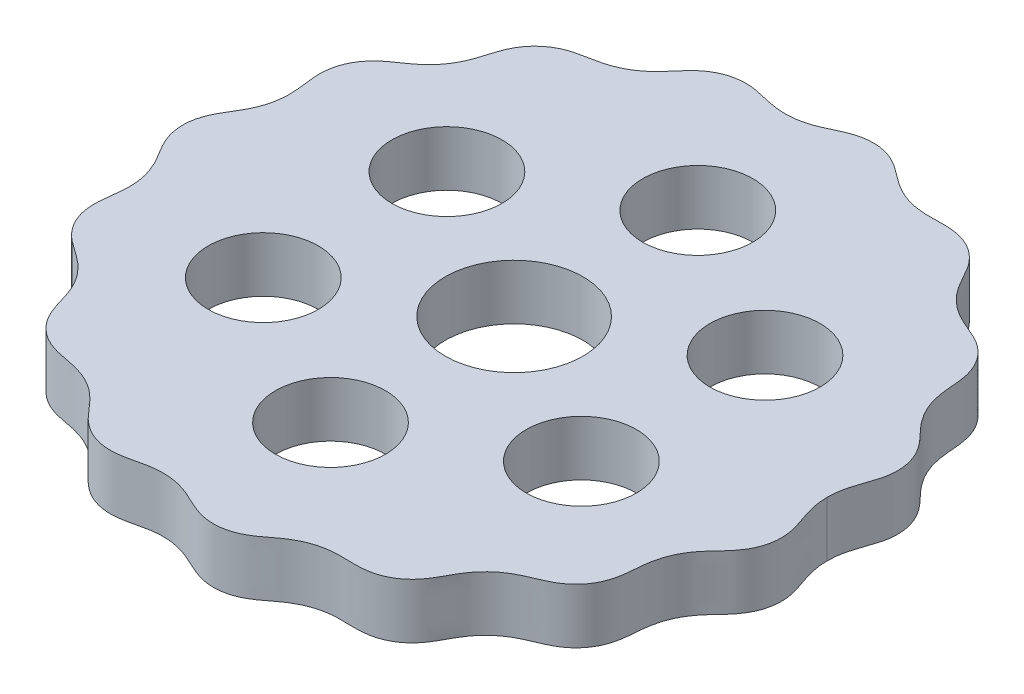
ISO-10303-21;
HEADER;
FILE_DESCRIPTION(('STEP AP214'),'2;1');
FILE_NAME('part.step','',(''),(''),'','','');
FILE_SCHEMA(('AUTOMOTIVE_DESIGN { 1 0 10303 214 1 1 1 1 }'));
ENDSEC;
DATA;
#1=APPLICATION_CONTEXT('core data for automotive mechanical design processes');
#2=APPLICATION_PROTOCOL_DEFINITION('international standard','automotive_design',2000,#1);
#3=PRODUCT_CONTEXT('',#1,'mechanical');
#4=PRODUCT('Part','Part','',(#3));
#5=PRODUCT_RELATED_PRODUCT_CATEGORY('part','',(#4));
#6=PRODUCT_DEFINITION_FORMATION('','',#4);
#7=PRODUCT_DEFINITION_CONTEXT('part definition',#1,'design');
#8=PRODUCT_DEFINITION('design','',#6,#7);
#9=PRODUCT_DEFINITION_SHAPE('','',#8);
#10=(LENGTH_UNIT() NAMED_UNIT(*) SI_UNIT(.MILLI.,.METRE.));
#11=(NAMED_UNIT(*) PLANE_ANGLE_UNIT() SI_UNIT($,.RADIAN.));
#12=(NAMED_UNIT(*) SI_UNIT($,.STERADIAN.) SOLID_ANGLE_UNIT());
#13=UNCERTAINTY_MEASURE_WITH_UNIT(LENGTH_MEASURE(1.E-05),#10,'distance_accuracy_value','');
#14=(GEOMETRIC_REPRESENTATION_CONTEXT(3) GLOBAL_UNCERTAINTY_ASSIGNED_CONTEXT((#13)) GLOBAL_UNIT_ASSIGNED_CONTEXT((#10,
#11,#12)) REPRESENTATION_CONTEXT('',''));
#15=CARTESIAN_POINT('',(0.,0.,0.));
#16=DIRECTION('',(0.,0.,1.));
#17=DIRECTION('',(1.,0.,0.));
#18=AXIS2_PLACEMENT_3D('',#15,#16,#17);
#19=CARTESIAN_POINT('',(-35.1,6.,-1.35889516192071E-12));
#20=CARTESIAN_POINT('',(-35.1000000000083,6.,0.607115846350076));
#21=CARTESIAN_POINT('',(-34.9035600959464,6.,1.83414533775393));
#22=CARTESIAN_POINT('',(-34.0534432954252,6.,3.45944018642695));
#23=CARTESIAN_POINT('',(-33.0776124702075,6.,4.95884864860067));
#24=CARTESIAN_POINT('',(-32.4003701245092,6.,6.61149440452536));
#25=CARTESIAN_POINT('',(-32.1262299289566,6.,8.37766255840162));
#26=CARTESIAN_POINT('',(-32.2542709762599,6.,10.1551809611175));
#27=CARTESIAN_POINT('',(-32.5481890198447,6.,11.9412915781165));
#28=CARTESIAN_POINT('',(-32.3951682574332,6.,13.7860860109237));
#29=CARTESIAN_POINT('',(-31.6585541398098,6.,15.4884654092379));
#30=CARTESIAN_POINT('',(-30.4193559166323,6.,16.8654573614074));
#31=CARTESIAN_POINT('',(-28.8990414539917,6.,17.8542998251563));
#32=CARTESIAN_POINT('',(-27.4779756494178,6.,18.9294391734281));
#33=CARTESIAN_POINT('',(-26.3272029489261,6.,20.2969563921251));
#34=CARTESIAN_POINT('',(-25.5276464963381,6.,21.8947419545972));
#35=CARTESIAN_POINT('',(-25.0543546395131,6.,23.6168737991937));
#36=CARTESIAN_POINT('',(-24.2447417173247,6.,25.9251570963651));
#37=CARTESIAN_POINT('',(-22.3688342971235,6.,27.6956794406858));
#38=CARTESIAN_POINT('',(-20.0034613218681,6.,28.3479396382792));
#39=CARTESIAN_POINT('',(-18.2333283288682,6.,28.6161520403931));
#40=CARTESIAN_POINT('',(-16.5433330334016,6.,29.1931204752014));
#41=CARTESIAN_POINT('',(-15.0321793566839,6.,30.1474106772307));
#42=CARTESIAN_POINT('',(-13.7791000612083,6.,31.4151591584304));
#43=CARTESIAN_POINT('',(-12.6573823156915,6.,32.8313003415023));
#44=CARTESIAN_POINT('',(-11.2102625001448,6.,33.9831920915477));
#45=CARTESIAN_POINT('',(-9.46489468071028,6.,34.6119091760879));
#46=CARTESIAN_POINT('',(-7.61174156474774,6.,34.6537863282432));
#47=CARTESIAN_POINT('',(-5.85214939866915,6.,34.1999562979753));
#48=CARTESIAN_POINT('',(-4.10728227679372,6.,33.8401284925221));
#49=CARTESIAN_POINT('',(-2.32003151093476,6.,33.8721600348226));
#50=CARTESIAN_POINT('',(-0.590246139454145,6.,34.3205880619044));
#51=CARTESIAN_POINT('',(1.01167971219936,6.,35.1075574299183));
#52=CARTESIAN_POINT('',(2.68959772890745,6.,35.8385274922358));
#53=CARTESIAN_POINT('',(4.53648932254374,6.,36.0207007386191));
#54=CARTESIAN_POINT('',(6.34698364247792,6.,35.6137100531044));
#55=CARTESIAN_POINT('',(7.91909592933828,6.,34.6549768012175));
#56=CARTESIAN_POINT('',(9.30016459818165,6.,33.5106448275672));
#57=CARTESIAN_POINT('',(10.8459869325331,6.,32.6180158311924));
#58=CARTESIAN_POINT('',(12.5583926639328,6.,32.106356527468));
#59=CARTESIAN_POINT('',(14.3382135479135,6.,31.9981206269951));
#60=CARTESIAN_POINT('',(16.1374506832666,6.,32.11702774334));
#61=CARTESIAN_POINT('',(17.9662420721715,6.,31.8525885984744));
#62=CARTESIAN_POINT('',(19.6192651011493,6.,31.0109500458056));
#63=CARTESIAN_POINT('',(20.9208969349607,6.,29.6894298943462));
#64=CARTESIAN_POINT('',(21.7800368665688,6.,28.0848882805329));
#65=CARTESIAN_POINT('',(22.9510459824635,6.,26.0155604593835));
#66=CARTESIAN_POINT('',(24.7829939188167,6.,24.4241081031639));
#67=CARTESIAN_POINT('',(26.9848539327865,6.,23.5230590115621));
#68=CARTESIAN_POINT('',(28.6586120120638,6.,22.7907576940546));
#69=CARTESIAN_POINT('',(30.0569603810619,6.,21.5709093750893));
#70=CARTESIAN_POINT('',(31.0000884838404,6.,19.9729844350802));
#71=CARTESIAN_POINT('',(31.3766807908307,6.,18.1686137994756));
#72=CARTESIAN_POINT('',(31.4464708516203,6.,16.3727232378514));
#73=CARTESIAN_POINT('',(31.7910932959064,6.,14.622304808056));
#74=CARTESIAN_POINT('',(32.530885603043,6.,12.995457988117));
#75=CARTESIAN_POINT('',(33.6215993311502,6.,11.5839557028317));
#76=CARTESIAN_POINT('',(34.9126415688619,6.,10.3300203001602));
#77=CARTESIAN_POINT('',(35.9715259689362,6.,8.81810694970155));
#78=CARTESIAN_POINT('',(36.490090079868,6.,7.03669157524542));
#79=CARTESIAN_POINT('',(36.4202580887475,6.,5.18292269242367));
#80=CARTESIAN_POINT('',(35.8206494173054,6.,3.46022188276184));
#81=CARTESIAN_POINT('',(35.2403631920576,6.,1.7753714443529));
#82=CARTESIAN_POINT('',(35.0999999999452,6.,0.590505396242624));
#83=CARTESIAN_POINT('',(35.1,6.,9.28990144123127E-12));
#84=B_SPLINE_CURVE_WITH_KNOTS('',3,(#19,#20,#21,#22,#23,#24,#25,#26,#27,#28,#29,#30,#31,#32,#33,
#34,#35,#36,#37,#38,#39,#40,#41,#42,#43,#44,#45,#46,#47,#48,#49,#50,#51,#52,#53,#54,#55,#56,#57,
#58,#59,#60,#61,#62,#63,#64,#65,#66,#67,#68,#69,#70,#71,#72,#73,#74,#75,#76,#77,#78,#79,#80,#81,
#82,#83),.UNSPECIFIED.,.F.,.F.,(4,1,1,1,1,1,1,1,1,1,1,1,1,1,1,1,1,1,1,1,1,1,1,1,1,1,1,1,1,1,1,1,
1,1,1,1,1,1,1,1,1,1,1,1,1,1,1,1,1,1,1,1,1,1,1,1,1,1,1,1,1,1,4),(0.0723695662334952,
0.0856649243269337,0.0989602824203721,0.112255640513811,0.125550998607249,0.138846356700688,
0.152141714794126,0.165437072887564,0.178732430981003,0.192027789074441,0.20532314716788,
0.218618505261318,0.231913863354757,0.245209221448195,0.258504579541634,0.271799937635072,
0.285095295728511,0.311686011915388,0.324981370008826,0.338276728102265,0.351572086195703,
0.364867444289141,0.37816280238258,0.391458160476018,0.404753518569457,0.418048876662895,
0.431344234756334,0.444639592849772,0.457934950943211,0.471230309036649,0.484525667130088,
0.497821025223526,0.511116383316965,0.524411741410403,0.537707099503842,0.55100245759728,
0.564297815690718,0.577593173784157,0.590888531877595,0.604183889971034,0.617479248064472,
0.630774606157911,0.644069964251349,0.657365322344788,0.670660680438226,0.683956038531665,
0.710546754718542,0.72384211281198,0.737137470905418,0.750432828998857,0.763728187092295,
0.777023545185734,0.790318903279172,0.803614261372611,0.816909619466049,0.830204977559488,
0.843500335652926,0.856795693746365,0.870091051839803,0.883386409933242,0.89668176802668,
0.909977126120118,0.923272484213557),.UNSPECIFIED.);
#85=DIRECTION('',(0.,-1.,0.));
#86=VECTOR('',#85,1.);
#87=SURFACE_OF_LINEAR_EXTRUSION('',#84,#86);
#88=CARTESIAN_POINT('',(-35.1,0.,-1.35889516192071E-12));
#89=CARTESIAN_POINT('',(-35.1000000000083,0.,0.607115846350076));
#90=CARTESIAN_POINT('',(-34.9035600959464,0.,1.83414533775393));
#91=CARTESIAN_POINT('',(-34.0534432954252,0.,3.45944018642695));
#92=CARTESIAN_POINT('',(-33.0776124702075,0.,4.95884864860067));
#93=CARTESIAN_POINT('',(-32.4003701245092,0.,6.61149440452536));
#94=CARTESIAN_POINT('',(-32.1262299289566,0.,8.37766255840162));
#95=CARTESIAN_POINT('',(-32.2542709762599,0.,10.1551809611175));
#96=CARTESIAN_POINT('',(-32.5481890198447,0.,11.9412915781165));
#97=CARTESIAN_POINT('',(-32.3951682574332,0.,13.7860860109237));
#98=CARTESIAN_POINT('',(-31.6585541398098,0.,15.4884654092379));
#99=CARTESIAN_POINT('',(-30.4193559166323,0.,16.8654573614074));
#100=CARTESIAN_POINT('',(-28.8990414539917,0.,17.8542998251563));
#101=CARTESIAN_POINT('',(-27.4779756494178,0.,18.9294391734281));
#102=CARTESIAN_POINT('',(-26.3272029489261,0.,20.2969563921251));
#103=CARTESIAN_POINT('',(-25.5276464963381,0.,21.8947419545972));
#104=CARTESIAN_POINT('',(-25.0543546395131,0.,23.6168737991937));
#105=CARTESIAN_POINT('',(-24.2447417173247,0.,25.9251570963651));
#106=CARTESIAN_POINT('',(-22.3688342971235,0.,27.6956794406858));
#107=CARTESIAN_POINT('',(-20.0034613218681,0.,28.3479396382792));
#108=CARTESIAN_POINT('',(-18.2333283288682,0.,28.6161520403931));
#109=CARTESIAN_POINT('',(-16.5433330334016,0.,29.1931204752014));
#110=CARTESIAN_POINT('',(-15.0321793566839,0.,30.1474106772307));
#111=CARTESIAN_POINT('',(-13.7791000612083,0.,31.4151591584304));
#112=CARTESIAN_POINT('',(-12.6573823156915,0.,32.8313003415023));
#113=CARTESIAN_POINT('',(-11.2102625001448,0.,33.9831920915477));
#114=CARTESIAN_POINT('',(-9.46489468071028,0.,34.6119091760879));
#115=CARTESIAN_POINT('',(-7.61174156474774,0.,34.6537863282432));
#116=CARTESIAN_POINT('',(-5.85214939866915,0.,34.1999562979753));
#117=CARTESIAN_POINT('',(-4.10728227679372,0.,33.8401284925221));
#118=CARTESIAN_POINT('',(-2.32003151093476,0.,33.8721600348226));
#119=CARTESIAN_POINT('',(-0.590246139454145,0.,34.3205880619044));
#120=CARTESIAN_POINT('',(1.01167971219936,0.,35.1075574299183));
#121=CARTESIAN_POINT('',(2.68959772890745,0.,35.8385274922358));
#122=CARTESIAN_POINT('',(4.53648932254374,0.,36.0207007386191));
#123=CARTESIAN_POINT('',(6.34698364247792,0.,35.6137100531044));
#124=CARTESIAN_POINT('',(7.91909592933828,0.,34.6549768012175));
#125=CARTESIAN_POINT('',(9.30016459818165,0.,33.5106448275672));
#126=CARTESIAN_POINT('',(10.8459869325331,0.,32.6180158311924));
#127=CARTESIAN_POINT('',(12.5583926639328,0.,32.106356527468));
#128=CARTESIAN_POINT('',(14.3382135479135,0.,31.9981206269951));
#129=CARTESIAN_POINT('',(16.1374506832666,0.,32.11702774334));
#130=CARTESIAN_POINT('',(17.9662420721715,0.,31.8525885984744));
#131=CARTESIAN_POINT('',(19.6192651011493,0.,31.0109500458056));
#132=CARTESIAN_POINT('',(20.9208969349607,0.,29.6894298943462));
#133=CARTESIAN_POINT('',(21.7800368665688,0.,28.0848882805329));
#134=CARTESIAN_POINT('',(22.9510459824635,0.,26.0155604593835));
#135=CARTESIAN_POINT('',(24.7829939188167,0.,24.4241081031639));
#136=CARTESIAN_POINT('',(26.9848539327865,0.,23.5230590115621));
#137=CARTESIAN_POINT('',(28.6586120120638,0.,22.7907576940546));
#138=CARTESIAN_POINT('',(30.0569603810619,0.,21.5709093750893));
#139=CARTESIAN_POINT('',(31.0000884838404,0.,19.9729844350802));
#140=CARTESIAN_POINT('',(31.3766807908307,0.,18.1686137994756));
#141=CARTESIAN_POINT('',(31.4464708516203,0.,16.3727232378514));
#142=CARTESIAN_POINT('',(31.7910932959064,0.,14.622304808056));
#143=CARTESIAN_POINT('',(32.530885603043,0.,12.995457988117));
#144=CARTESIAN_POINT('',(33.6215993311502,0.,11.5839557028317));
#145=CARTESIAN_POINT('',(34.9126415688619,0.,10.3300203001602));
#146=CARTESIAN_POINT('',(35.9715259689362,0.,8.81810694970155));
#147=CARTESIAN_POINT('',(36.490090079868,0.,7.03669157524542));
#148=CARTESIAN_POINT('',(36.4202580887475,0.,5.18292269242367));
#149=CARTESIAN_POINT('',(35.8206494173054,0.,3.46022188276184));
#150=CARTESIAN_POINT('',(35.2403631920576,0.,1.7753714443529));
#151=CARTESIAN_POINT('',(35.0999999999452,0.,0.590505396242624));
#152=CARTESIAN_POINT('',(35.1,0.,9.28990144123127E-12));
#153=B_SPLINE_CURVE_WITH_KNOTS('',3,(#88,#89,#90,#91,#92,#93,#94,#95,#96,#97,#98,#99,#100,#101,
#102,#103,#104,#105,#106,#107,#108,#109,#110,#111,#112,#113,#114,#115,#116,#117,#118,#119,#120,
#121,#122,#123,#124,#125,#126,#127,#128,#129,#130,#131,#132,#133,#134,#135,#136,#137,#138,#139,
#140,#141,#142,#143,#144,#145,#146,#147,#148,#149,#150,#151,#152),.UNSPECIFIED.,.F.,.F.,(4,1,1,
1,1,1,1,1,1,1,1,1,1,1,1,1,1,1,1,1,1,1,1,1,1,1,1,1,1,1,1,1,1,1,1,1,1,1,1,1,1,1,1,1,1,1,1,1,1,1,1,
1,1,1,1,1,1,1,1,1,1,1,4),(0.0723695662334952,0.0856649243269337,0.0989602824203721,
0.112255640513811,0.125550998607249,0.138846356700688,0.152141714794126,0.165437072887564,
0.178732430981003,0.192027789074441,0.20532314716788,0.218618505261318,0.231913863354757,
0.245209221448195,0.258504579541634,0.271799937635072,0.285095295728511,0.311686011915388,
0.324981370008826,0.338276728102265,0.351572086195703,0.364867444289141,0.37816280238258,
0.391458160476018,0.404753518569457,0.418048876662895,0.431344234756334,0.444639592849772,
0.457934950943211,0.471230309036649,0.484525667130088,0.497821025223526,0.511116383316965,
0.524411741410403,0.537707099503842,0.55100245759728,0.564297815690718,0.577593173784157,
0.590888531877595,0.604183889971034,0.617479248064472,0.630774606157911,0.644069964251349,
0.657365322344788,0.670660680438226,0.683956038531665,0.710546754718542,0.72384211281198,
0.737137470905418,0.750432828998857,0.763728187092295,0.777023545185734,0.790318903279172,
0.803614261372611,0.816909619466049,0.830204977559488,0.843500335652926,0.856795693746365,
0.870091051839803,0.883386409933242,0.89668176802668,0.909977126120118,0.923272484213557),.UNSPECIFIED.);
#154=CARTESIAN_POINT('',(-35.1,0.,2.73014391567173E-12));
#155=VERTEX_POINT('',#154);
#156=CARTESIAN_POINT('',(35.1,0.,-1.86539243738103E-11));
#157=VERTEX_POINT('',#156);
#158=EDGE_CURVE('E79',#155,#157,#153,.T.);
#159=ORIENTED_EDGE('',*,*,#158,.T.);
#160=DIRECTION('',(0.,-1.,0.));
#161=VECTOR('',#160,1.);
#162=CARTESIAN_POINT('',(35.1,6.,-1.86539243738103E-11));
#163=LINE('',#162,#161);
#164=CARTESIAN_POINT('',(35.1,6.,-1.86539243738103E-11));
#165=VERTEX_POINT('',#164);
#166=EDGE_CURVE('E11',#165,#157,#163,.T.);
#167=ORIENTED_EDGE('',*,*,#166,.F.);
#168=CARTESIAN_POINT('',(-35.1,6.,2.73014391567173E-12));
#169=VERTEX_POINT('',#168);
#170=EDGE_CURVE('E78',#169,#165,#84,.T.);
#171=ORIENTED_EDGE('',*,*,#170,.F.);
#172=DIRECTION('',(0.,-1.,0.));
#173=VECTOR('',#172,1.);
#174=CARTESIAN_POINT('',(-35.1,6.,2.73014391567173E-12));
#175=LINE('',#174,#173);
#176=EDGE_CURVE('E55',#169,#155,#175,.T.);
#177=ORIENTED_EDGE('',*,*,#176,.T.);
#178=EDGE_LOOP('',(#159,#167,#171,#177));
#179=FACE_BOUND('',#178,.T.);
#180=ADVANCED_FACE('F45',(#179),#87,.F.);
#181=CARTESIAN_POINT('',(35.1,6.,-1.86539243738103E-11));
#182=CARTESIAN_POINT('',(35.0999999998899,6.,-0.590505396408624));
#183=CARTESIAN_POINT('',(35.24036319207,6.,-1.77537144498298));
#184=CARTESIAN_POINT('',(35.8206494172766,6.,-3.46022188320951));
#185=CARTESIAN_POINT('',(36.4202580887157,6.,-5.18292269292511));
#186=CARTESIAN_POINT('',(36.490090079822,6.,-7.03669157573395));
#187=CARTESIAN_POINT('',(35.9715259688793,6.,-8.8181069501903));
#188=CARTESIAN_POINT('',(34.912641568795,6.,-10.3300203006411));
#189=CARTESIAN_POINT('',(33.6215993310753,6.,-11.5839557033045));
#190=CARTESIAN_POINT('',(32.5308856029589,6.,-12.9954579885828));
#191=CARTESIAN_POINT('',(31.7910932958118,6.,-14.6223048085169));
#192=CARTESIAN_POINT('',(31.4464708515143,6.,-16.3727232383101));
#193=CARTESIAN_POINT('',(31.3766807907132,6.,-18.1686137999339));
#194=CARTESIAN_POINT('',(31.0000884837112,6.,-19.9729844355361));
#195=CARTESIAN_POINT('',(30.0569603809224,6.,-21.570909375539));
#196=CARTESIAN_POINT('',(28.6586120119164,6.,-22.7907576944953));
#197=CARTESIAN_POINT('',(26.9848539326343,6.,-23.523059011992));
#198=CARTESIAN_POINT('',(24.7829939186587,6.,-24.4241081035795));
#199=CARTESIAN_POINT('',(22.9510459822952,6.,-26.0155604597872));
#200=CARTESIAN_POINT('',(21.7800368663871,6.,-28.0848882809291));
#201=CARTESIAN_POINT('',(20.9208969347686,6.,-29.6894298947368));
#202=CARTESIAN_POINT('',(19.6192651009486,6.,-31.0109500461878));
#203=CARTESIAN_POINT('',(17.9662420719655,6.,-31.8525885988459));
#204=CARTESIAN_POINT('',(16.1374506830588,6.,-32.1170277436997));
#205=CARTESIAN_POINT('',(14.3382135477065,6.,-31.9981206273432));
#206=CARTESIAN_POINT('',(12.5583926637251,6.,-32.1063565278045));
#207=CARTESIAN_POINT('',(10.8459869323221,6.,-32.6180158315178));
#208=CARTESIAN_POINT('',(9.30016459796487,6.,-33.5106448278827));
#209=CARTESIAN_POINT('',(7.9190959291141,6.,-34.654976801524));
#210=CARTESIAN_POINT('',(6.34698364224754,6.,-35.6137100534007));
#211=CARTESIAN_POINT('',(4.53648932231072,6.,-36.0207007389037));
#212=CARTESIAN_POINT('',(2.68959772867561,6.,-35.8385274925085));
#213=CARTESIAN_POINT('',(1.01167971197225,6.,-35.1075574301801));
#214=CARTESIAN_POINT('',(-0.590246139676162,6.,-34.3205880621559));
#215=CARTESIAN_POINT('',(-2.32003151115388,6.,-33.8721600350629));
#216=CARTESIAN_POINT('',(-4.10728227701263,6.,-33.8401284927509));
#217=CARTESIAN_POINT('',(-5.85214939889039,6.,-34.1999562981928));
#218=CARTESIAN_POINT('',(-7.61174156497191,6.,-34.6537863284493));
#219=CARTESIAN_POINT('',(-9.46489468093418,6.,-34.611909176282));
#220=CARTESIAN_POINT('',(-11.2102625003646,6.,-33.9831920917305));
#221=CARTESIAN_POINT('',(-12.6573823159039,6.,-32.8313003416758));
#222=CARTESIAN_POINT('',(-13.7791000614115,6.,-31.4151591585966));
#223=CARTESIAN_POINT('',(-15.0321793568789,6.,-30.1474106773887));
#224=CARTESIAN_POINT('',(-16.5433330335905,6.,-29.1931204753497));
#225=CARTESIAN_POINT('',(-18.2333283290534,6.,-28.6161520405305));
#226=CARTESIAN_POINT('',(-20.0034613220515,6.,-28.3479396384051));
#227=CARTESIAN_POINT('',(-22.3688342973027,6.,-27.6956794407964));
#228=CARTESIAN_POINT('',(-24.2447417174924,6.,-25.9251570964635));
#229=CARTESIAN_POINT('',(-25.0543546396658,6.,-23.6168737992869));
#230=CARTESIAN_POINT('',(-25.5276464964798,6.,-21.8947419546873));
#231=CARTESIAN_POINT('',(-26.3272029490574,6.,-20.2969563922101));
#232=CARTESIAN_POINT('',(-27.4779756495402,6.,-18.9294391735056));
#233=CARTESIAN_POINT('',(-28.8990414541072,6.,-17.8542998252247));
#234=CARTESIAN_POINT('',(-30.4193559167414,6.,-16.8654573614659));
#235=CARTESIAN_POINT('',(-31.65855413991,6.,-15.4884654092884));
#236=CARTESIAN_POINT('',(-32.3951682575224,6.,-13.7860860109695));
#237=CARTESIAN_POINT('',(-32.5481890199219,6.,-11.9412915781613));
#238=CARTESIAN_POINT('',(-32.2542709763256,6.,-10.1551809611642));
#239=CARTESIAN_POINT('',(-32.1262299290107,6.,-8.37766255844917));
#240=CARTESIAN_POINT('',(-32.400370124552,6.,-6.61149440457091));
#241=CARTESIAN_POINT('',(-33.0776124702394,6.,-4.95884864864269));
#242=CARTESIAN_POINT('',(-34.0534432954481,6.,-3.45944018645951));
#243=CARTESIAN_POINT('',(-34.9035600959563,6.,-1.83414533779269));
#244=CARTESIAN_POINT('',(-35.1000000000166,6.,-0.607115846358458));
#245=CARTESIAN_POINT('',(-35.1,6.,2.73014391567173E-12));
#246=B_SPLINE_CURVE_WITH_KNOTS('',3,(#181,#182,#183,#184,#185,#186,#187,#188,#189,#190,#191,
#192,#193,#194,#195,#196,#197,#198,#199,#200,#201,#202,#203,#204,#205,#206,#207,#208,#209,#210,
#211,#212,#213,#214,#215,#216,#217,#218,#219,#220,#221,#222,#223,#224,#225,#226,#227,#228,#229,
#230,#231,#232,#233,#234,#235,#236,#237,#238,#239,#240,#241,#242,#243,#244,#245),.UNSPECIFIED.,
.F.,.F.,(4,1,1,1,1,1,1,1,1,1,1,1,1,1,1,1,1,1,1,1,1,1,1,1,1,1,1,1,1,1,1,1,1,1,1,1,1,1,1,1,1,1,1,
1,1,1,1,1,1,1,1,1,1,1,1,1,1,1,1,1,1,1,4),(0.0723695662334952,0.0856649243269337,
0.0989602824203721,0.112255640513811,0.125550998607249,0.138846356700688,0.152141714794126,
0.165437072887564,0.178732430981003,0.192027789074441,0.20532314716788,0.218618505261318,
0.231913863354757,0.245209221448195,0.258504579541634,0.271799937635072,0.285095295728511,
0.311686011915388,0.324981370008826,0.338276728102265,0.351572086195703,0.364867444289141,
0.37816280238258,0.391458160476018,0.404753518569457,0.418048876662895,0.431344234756334,
0.444639592849772,0.457934950943211,0.471230309036649,0.484525667130088,0.497821025223526,
0.511116383316965,0.524411741410403,0.537707099503842,0.55100245759728,0.564297815690718,
0.577593173784157,0.590888531877595,0.604183889971034,0.617479248064472,0.630774606157911,
0.644069964251349,0.657365322344788,0.670660680438226,0.683956038531665,0.710546754718541,
0.72384211281198,0.737137470905418,0.750432828998857,0.763728187092295,0.777023545185734,
0.790318903279172,0.803614261372611,0.816909619466049,0.830204977559488,0.843500335652926,
0.856795693746365,0.870091051839803,0.883386409933242,0.89668176802668,0.909977126120118,
0.923272484213557),.UNSPECIFIED.);
#247=DIRECTION('',(0.,-1.,0.));
#248=VECTOR('',#247,1.);
#249=SURFACE_OF_LINEAR_EXTRUSION('',#246,#248);
#250=CARTESIAN_POINT('',(35.1,0.,-1.86539243738103E-11));
#251=CARTESIAN_POINT('',(35.0999999998899,0.,-0.590505396408624));
#252=CARTESIAN_POINT('',(35.24036319207,0.,-1.77537144498298));
#253=CARTESIAN_POINT('',(35.8206494172766,0.,-3.46022188320951));
#254=CARTESIAN_POINT('',(36.4202580887157,0.,-5.18292269292511));
#255=CARTESIAN_POINT('',(36.490090079822,0.,-7.03669157573395));
#256=CARTESIAN_POINT('',(35.9715259688793,0.,-8.8181069501903));
#257=CARTESIAN_POINT('',(34.912641568795,0.,-10.3300203006411));
#258=CARTESIAN_POINT('',(33.6215993310753,0.,-11.5839557033045));
#259=CARTESIAN_POINT('',(32.5308856029589,0.,-12.9954579885828));
#260=CARTESIAN_POINT('',(31.7910932958118,0.,-14.6223048085169));
#261=CARTESIAN_POINT('',(31.4464708515143,0.,-16.3727232383101));
#262=CARTESIAN_POINT('',(31.3766807907132,0.,-18.1686137999339));
#263=CARTESIAN_POINT('',(31.0000884837112,0.,-19.9729844355361));
#264=CARTESIAN_POINT('',(30.0569603809224,0.,-21.570909375539));
#265=CARTESIAN_POINT('',(28.6586120119164,0.,-22.7907576944953));
#266=CARTESIAN_POINT('',(26.9848539326343,0.,-23.523059011992));
#267=CARTESIAN_POINT('',(24.7829939186587,0.,-24.4241081035795));
#268=CARTESIAN_POINT('',(22.9510459822952,0.,-26.0155604597872));
#269=CARTESIAN_POINT('',(21.7800368663871,0.,-28.0848882809291));
#270=CARTESIAN_POINT('',(20.9208969347686,0.,-29.6894298947368));
#271=CARTESIAN_POINT('',(19.6192651009486,0.,-31.0109500461878));
#272=CARTESIAN_POINT('',(17.9662420719655,0.,-31.8525885988459));
#273=CARTESIAN_POINT('',(16.1374506830588,0.,-32.1170277436997));
#274=CARTESIAN_POINT('',(14.3382135477065,0.,-31.9981206273432));
#275=CARTESIAN_POINT('',(12.5583926637251,0.,-32.1063565278045));
#276=CARTESIAN_POINT('',(10.8459869323221,0.,-32.6180158315178));
#277=CARTESIAN_POINT('',(9.30016459796487,0.,-33.5106448278827));
#278=CARTESIAN_POINT('',(7.9190959291141,0.,-34.654976801524));
#279=CARTESIAN_POINT('',(6.34698364224754,0.,-35.6137100534007));
#280=CARTESIAN_POINT('',(4.53648932231072,0.,-36.0207007389037));
#281=CARTESIAN_POINT('',(2.68959772867561,0.,-35.8385274925085));
#282=CARTESIAN_POINT('',(1.01167971197225,0.,-35.1075574301801));
#283=CARTESIAN_POINT('',(-0.590246139676162,0.,-34.3205880621559));
#284=CARTESIAN_POINT('',(-2.32003151115388,0.,-33.8721600350629));
#285=CARTESIAN_POINT('',(-4.10728227701263,0.,-33.8401284927509));
#286=CARTESIAN_POINT('',(-5.85214939889039,0.,-34.1999562981928));
#287=CARTESIAN_POINT('',(-7.61174156497191,0.,-34.6537863284493));
#288=CARTESIAN_POINT('',(-9.46489468093418,0.,-34.611909176282));
#289=CARTESIAN_POINT('',(-11.2102625003646,0.,-33.9831920917305));
#290=CARTESIAN_POINT('',(-12.6573823159039,0.,-32.8313003416758));
#291=CARTESIAN_POINT('',(-13.7791000614115,0.,-31.4151591585966));
#292=CARTESIAN_POINT('',(-15.0321793568789,0.,-30.1474106773887));
#293=CARTESIAN_POINT('',(-16.5433330335905,0.,-29.1931204753497));
#294=CARTESIAN_POINT('',(-18.2333283290534,0.,-28.6161520405305));
#295=CARTESIAN_POINT('',(-20.0034613220515,0.,-28.3479396384051));
#296=CARTESIAN_POINT('',(-22.3688342973027,0.,-27.6956794407964));
#297=CARTESIAN_POINT('',(-24.2447417174924,0.,-25.9251570964635));
#298=CARTESIAN_POINT('',(-25.0543546396658,0.,-23.6168737992869));
#299=CARTESIAN_POINT('',(-25.5276464964798,0.,-21.8947419546873));
#300=CARTESIAN_POINT('',(-26.3272029490574,0.,-20.2969563922101));
#301=CARTESIAN_POINT('',(-27.4779756495402,0.,-18.9294391735056));
#302=CARTESIAN_POINT('',(-28.8990414541072,0.,-17.8542998252247));
#303=CARTESIAN_POINT('',(-30.4193559167414,0.,-16.8654573614659));
#304=CARTESIAN_POINT('',(-31.65855413991,0.,-15.4884654092884));
#305=CARTESIAN_POINT('',(-32.3951682575224,0.,-13.7860860109695));
#306=CARTESIAN_POINT('',(-32.5481890199219,0.,-11.9412915781613));
#307=CARTESIAN_POINT('',(-32.2542709763256,0.,-10.1551809611642));
#308=CARTESIAN_POINT('',(-32.1262299290107,0.,-8.37766255844917));
#309=CARTESIAN_POINT('',(-32.400370124552,0.,-6.61149440457091));
#310=CARTESIAN_POINT('',(-33.0776124702394,0.,-4.95884864864269));
#311=CARTESIAN_POINT('',(-34.0534432954481,0.,-3.45944018645951));
#312=CARTESIAN_POINT('',(-34.9035600959563,0.,-1.83414533779269));
#313=CARTESIAN_POINT('',(-35.1000000000166,0.,-0.607115846358458));
#314=CARTESIAN_POINT('',(-35.1,0.,2.73014391567173E-12));
#315=B_SPLINE_CURVE_WITH_KNOTS('',3,(#250,#251,#252,#253,#254,#255,#256,#257,#258,#259,#260,
#261,#262,#263,#264,#265,#266,#267,#268,#269,#270,#271,#272,#273,#274,#275,#276,#277,#278,#279,
#280,#281,#282,#283,#284,#285,#286,#287,#288,#289,#290,#291,#292,#293,#294,#295,#296,#297,#298,
#299,#300,#301,#302,#303,#304,#305,#306,#307,#308,#309,#310,#311,#312,#313,#314),.UNSPECIFIED.,
.F.,.F.,(4,1,1,1,1,1,1,1,1,1,1,1,1,1,1,1,1,1,1,1,1,1,1,1,1,1,1,1,1,1,1,1,1,1,1,1,1,1,1,1,1,1,1,
1,1,1,1,1,1,1,1,1,1,1,1,1,1,1,1,1,1,1,4),(0.0723695662334952,0.0856649243269337,
0.0989602824203721,0.112255640513811,0.125550998607249,0.138846356700688,0.152141714794126,
0.165437072887564,0.178732430981003,0.192027789074441,0.20532314716788,0.218618505261318,
0.231913863354757,0.245209221448195,0.258504579541634,0.271799937635072,0.285095295728511,
0.311686011915388,0.324981370008826,0.338276728102265,0.351572086195703,0.364867444289141,
0.37816280238258,0.391458160476018,0.404753518569457,0.418048876662895,0.431344234756334,
0.444639592849772,0.457934950943211,0.471230309036649,0.484525667130088,0.497821025223526,
0.511116383316965,0.524411741410403,0.537707099503842,0.55100245759728,0.564297815690718,
0.577593173784157,0.590888531877595,0.604183889971034,0.617479248064472,0.630774606157911,
0.644069964251349,0.657365322344788,0.670660680438226,0.683956038531665,0.710546754718541,
0.72384211281198,0.737137470905418,0.750432828998857,0.763728187092295,0.777023545185734,
0.790318903279172,0.803614261372611,0.816909619466049,0.830204977559488,0.843500335652926,
0.856795693746365,0.870091051839803,0.883386409933242,0.89668176802668,0.909977126120118,
0.923272484213557),.UNSPECIFIED.);
#316=EDGE_CURVE('E70',#157,#155,#315,.T.);
#317=ORIENTED_EDGE('',*,*,#316,.T.);
#318=ORIENTED_EDGE('',*,*,#176,.F.);
#319=EDGE_CURVE('E62',#165,#169,#246,.T.);
#320=ORIENTED_EDGE('',*,*,#319,.F.);
#321=ORIENTED_EDGE('',*,*,#166,.T.);
#322=EDGE_LOOP('',(#317,#318,#320,#321));
#323=FACE_BOUND('',#322,.T.);
#324=ADVANCED_FACE('F73',(#323),#249,.F.);
#325=CARTESIAN_POINT('',(1.02434507304179,6.,35.0982242123022));
#326=DIRECTION('',(0.,-1.,0.));
#327=DIRECTION('',(0.,0.,-1.));
#328=AXIS2_PLACEMENT_3D('',#325,#326,#327);
#329=PLANE('',#328);
#330=CARTESIAN_POINT('',(-16.3205080756888,6.,-10.));
#331=DIRECTION('',(0.,1.,0.));
#332=DIRECTION('',(0.,0.,1.));
#333=AXIS2_PLACEMENT_3D('',#330,#331,#332);
#334=CIRCLE('',#333,6.);
#335=CARTESIAN_POINT('',(-16.3205080756888,6.,-4.));
#336=VERTEX_POINT('',#335);
#337=EDGE_CURVE('E263',#336,#336,#334,.T.);
#338=ORIENTED_EDGE('',*,*,#337,.F.);
#339=EDGE_LOOP('',(#338));
#340=FACE_BOUND('',#339,.T.);
#341=CARTESIAN_POINT('',(-16.3205080756888,6.,10.));
#342=DIRECTION('',(0.,1.,0.));
#343=DIRECTION('',(0.,0.,1.));
#344=AXIS2_PLACEMENT_3D('',#341,#342,#343);
#345=CIRCLE('',#344,6.);
#346=CARTESIAN_POINT('',(-16.3205080756888,6.,16.));
#347=VERTEX_POINT('',#346);
#348=EDGE_CURVE('E255',#347,#347,#345,.T.);
#349=ORIENTED_EDGE('',*,*,#348,.F.);
#350=EDGE_LOOP('',(#349));
#351=FACE_BOUND('',#350,.T.);
#352=CARTESIAN_POINT('',(1.,6.,20.));
#353=DIRECTION('',(0.,1.,0.));
#354=DIRECTION('',(0.,0.,1.));
#355=AXIS2_PLACEMENT_3D('',#352,#353,#354);
#356=CIRCLE('',#355,6.00000000000001);
#357=CARTESIAN_POINT('',(1.,6.,26.));
#358=VERTEX_POINT('',#357);
#359=EDGE_CURVE('E247',#358,#358,#356,.T.);
#360=ORIENTED_EDGE('',*,*,#359,.F.);
#361=EDGE_LOOP('',(#360));
#362=FACE_BOUND('',#361,.T.);
#363=CARTESIAN_POINT('',(18.3205080756888,6.,10.));
#364=DIRECTION('',(0.,1.,0.));
#365=DIRECTION('',(0.,0.,1.));
#366=AXIS2_PLACEMENT_3D('',#363,#364,#365);
#367=CIRCLE('',#366,6.00000000000001);
#368=CARTESIAN_POINT('',(18.3205080756888,6.,16.));
#369=VERTEX_POINT('',#368);
#370=EDGE_CURVE('E239',#369,#369,#367,.T.);
#371=ORIENTED_EDGE('',*,*,#370,.F.);
#372=EDGE_LOOP('',(#371));
#373=FACE_BOUND('',#372,.T.);
#374=CARTESIAN_POINT('',(18.3205080756888,6.,-10.));
#375=DIRECTION('',(0.,1.,0.));
#376=DIRECTION('',(0.,0.,1.));
#377=AXIS2_PLACEMENT_3D('',#374,#375,#376);
#378=CIRCLE('',#377,6.);
#379=CARTESIAN_POINT('',(18.3205080756888,6.,-4.));
#380=VERTEX_POINT('',#379);
#381=EDGE_CURVE('E229',#380,#380,#378,.T.);
#382=ORIENTED_EDGE('',*,*,#381,.F.);
#383=EDGE_LOOP('',(#382));
#384=FACE_BOUND('',#383,.T.);
#385=CARTESIAN_POINT('',(0.999999999999997,6.,-20.));
#386=DIRECTION('',(0.,1.,0.));
#387=DIRECTION('',(0.,0.,1.));
#388=AXIS2_PLACEMENT_3D('',#385,#386,#387);
#389=CIRCLE('',#388,6.);
#390=CARTESIAN_POINT('',(0.999999999999997,6.,-14.));
#391=VERTEX_POINT('',#390);
#392=EDGE_CURVE('E222',#391,#391,#389,.T.);
#393=ORIENTED_EDGE('',*,*,#392,.F.);
#394=EDGE_LOOP('',(#393));
#395=FACE_BOUND('',#394,.T.);
#396=CARTESIAN_POINT('',(0.999999999999997,6.,0.));
#397=DIRECTION('',(0.,1.,0.));
#398=DIRECTION('',(0.,0.,1.));
#399=AXIS2_PLACEMENT_3D('',#396,#397,#398);
#400=CIRCLE('',#399,7.5);
#401=CARTESIAN_POINT('',(0.999999999999997,6.,7.5));
#402=VERTEX_POINT('',#401);
#403=EDGE_CURVE('E89',#402,#402,#400,.T.);
#404=ORIENTED_EDGE('',*,*,#403,.F.);
#405=EDGE_LOOP('',(#404));
#406=FACE_BOUND('',#405,.T.);
#407=ORIENTED_EDGE('',*,*,#170,.T.);
#408=ORIENTED_EDGE('',*,*,#319,.T.);
#409=EDGE_LOOP('',(#407,#408));
#410=FACE_BOUND('',#409,.T.);
#411=ADVANCED_FACE('F115',(#340,#351,#362,#373,#384,#395,#406,#410),#329,.F.);
#412=CARTESIAN_POINT('',(1.02434507304179,0.,35.0982242123022));
#413=DIRECTION('',(0.,-1.,0.));
#414=DIRECTION('',(0.,0.,-1.));
#415=AXIS2_PLACEMENT_3D('',#412,#413,#414);
#416=PLANE('',#415);
#417=CARTESIAN_POINT('',(-16.3205080756888,0.,-10.));
#418=DIRECTION('',(0.,1.,0.));
#419=DIRECTION('',(0.,0.,1.));
#420=AXIS2_PLACEMENT_3D('',#417,#418,#419);
#421=CIRCLE('',#420,6.);
#422=CARTESIAN_POINT('',(-16.3205080756888,0.,-4.));
#423=VERTEX_POINT('',#422);
#424=EDGE_CURVE('E267',#423,#423,#421,.T.);
#425=ORIENTED_EDGE('',*,*,#424,.T.);
#426=EDGE_LOOP('',(#425));
#427=FACE_BOUND('',#426,.T.);
#428=CARTESIAN_POINT('',(-16.3205080756888,0.,10.));
#429=DIRECTION('',(0.,1.,0.));
#430=DIRECTION('',(0.,0.,1.));
#431=AXIS2_PLACEMENT_3D('',#428,#429,#430);
#432=CIRCLE('',#431,6.);
#433=CARTESIAN_POINT('',(-16.3205080756888,0.,16.));
#434=VERTEX_POINT('',#433);
#435=EDGE_CURVE('E259',#434,#434,#432,.T.);
#436=ORIENTED_EDGE('',*,*,#435,.T.);
#437=EDGE_LOOP('',(#436));
#438=FACE_BOUND('',#437,.T.);
#439=CARTESIAN_POINT('',(1.,0.,20.));
#440=DIRECTION('',(0.,1.,0.));
#441=DIRECTION('',(0.,0.,1.));
#442=AXIS2_PLACEMENT_3D('',#439,#440,#441);
#443=CIRCLE('',#442,6.00000000000001);
#444=CARTESIAN_POINT('',(1.,0.,26.));
#445=VERTEX_POINT('',#444);
#446=EDGE_CURVE('E251',#445,#445,#443,.T.);
#447=ORIENTED_EDGE('',*,*,#446,.T.);
#448=EDGE_LOOP('',(#447));
#449=FACE_BOUND('',#448,.T.);
#450=CARTESIAN_POINT('',(18.3205080756888,0.,10.));
#451=DIRECTION('',(0.,1.,0.));
#452=DIRECTION('',(0.,0.,1.));
#453=AXIS2_PLACEMENT_3D('',#450,#451,#452);
#454=CIRCLE('',#453,6.00000000000001);
#455=CARTESIAN_POINT('',(18.3205080756888,0.,16.));
#456=VERTEX_POINT('',#455);
#457=EDGE_CURVE('E243',#456,#456,#454,.T.);
#458=ORIENTED_EDGE('',*,*,#457,.T.);
#459=EDGE_LOOP('',(#458));
#460=FACE_BOUND('',#459,.T.);
#461=CARTESIAN_POINT('',(18.3205080756888,0.,-10.));
#462=DIRECTION('',(0.,1.,0.));
#463=DIRECTION('',(0.,0.,1.));
#464=AXIS2_PLACEMENT_3D('',#461,#462,#463);
#465=CIRCLE('',#464,6.);
#466=CARTESIAN_POINT('',(18.3205080756888,0.,-4.));
#467=VERTEX_POINT('',#466);
#468=EDGE_CURVE('E235',#467,#467,#465,.T.);
#469=ORIENTED_EDGE('',*,*,#468,.T.);
#470=EDGE_LOOP('',(#469));
#471=FACE_BOUND('',#470,.T.);
#472=CARTESIAN_POINT('',(0.999999999999997,0.,-20.));
#473=DIRECTION('',(0.,1.,0.));
#474=DIRECTION('',(0.,0.,1.));
#475=AXIS2_PLACEMENT_3D('',#472,#473,#474);
#476=CIRCLE('',#475,6.);
#477=CARTESIAN_POINT('',(0.999999999999997,0.,-14.));
#478=VERTEX_POINT('',#477);
#479=EDGE_CURVE('E219',#478,#478,#476,.T.);
#480=ORIENTED_EDGE('',*,*,#479,.T.);
#481=EDGE_LOOP('',(#480));
#482=FACE_BOUND('',#481,.T.);
#483=CARTESIAN_POINT('',(0.999999999999997,0.,0.));
#484=DIRECTION('',(0.,1.,0.));
#485=DIRECTION('',(0.,0.,1.));
#486=AXIS2_PLACEMENT_3D('',#483,#484,#485);
#487=CIRCLE('',#486,7.5);
#488=CARTESIAN_POINT('',(0.999999999999997,0.,7.5));
#489=VERTEX_POINT('',#488);
#490=EDGE_CURVE('E85',#489,#489,#487,.T.);
#491=ORIENTED_EDGE('',*,*,#490,.T.);
#492=EDGE_LOOP('',(#491));
#493=FACE_BOUND('',#492,.T.);
#494=ORIENTED_EDGE('',*,*,#158,.F.);
#495=ORIENTED_EDGE('',*,*,#316,.F.);
#496=EDGE_LOOP('',(#494,#495));
#497=FACE_BOUND('',#496,.T.);
#498=ADVANCED_FACE('F83',(#427,#438,#449,#460,#471,#482,#493,#497),#416,.T.);
#499=CARTESIAN_POINT('',(0.999999999999997,0.,0.));
#500=DIRECTION('',(0.,1.,0.));
#501=DIRECTION('',(0.,0.,1.));
#502=AXIS2_PLACEMENT_3D('',#499,#500,#501);
#503=CYLINDRICAL_SURFACE('',#502,7.5);
#504=ORIENTED_EDGE('',*,*,#490,.F.);
#505=EDGE_LOOP('',(#504));
#506=FACE_BOUND('',#505,.T.);
#507=ORIENTED_EDGE('',*,*,#403,.T.);
#508=EDGE_LOOP('',(#507));
#509=FACE_BOUND('',#508,.T.);
#510=ADVANCED_FACE('F118',(#506,#509),#503,.F.);
#511=CARTESIAN_POINT('',(0.999999999999997,0.,-20.));
#512=DIRECTION('',(0.,1.,0.));
#513=DIRECTION('',(0.,0.,1.));
#514=AXIS2_PLACEMENT_3D('',#511,#512,#513);
#515=CYLINDRICAL_SURFACE('',#514,6.);
#516=ORIENTED_EDGE('',*,*,#479,.F.);
#517=EDGE_LOOP('',(#516));
#518=FACE_BOUND('',#517,.T.);
#519=ORIENTED_EDGE('',*,*,#392,.T.);
#520=EDGE_LOOP('',(#519));
#521=FACE_BOUND('',#520,.T.);
#522=ADVANCED_FACE('F125',(#518,#521),#515,.F.);
#523=CARTESIAN_POINT('',(18.3205080756888,0.,-10.));
#524=DIRECTION('',(0.,1.,0.));
#525=DIRECTION('',(0.,0.,1.));
#526=AXIS2_PLACEMENT_3D('',#523,#524,#525);
#527=CYLINDRICAL_SURFACE('',#526,6.);
#528=ORIENTED_EDGE('',*,*,#468,.F.);
#529=EDGE_LOOP('',(#528));
#530=FACE_BOUND('',#529,.T.);
#531=ORIENTED_EDGE('',*,*,#381,.T.);
#532=EDGE_LOOP('',(#531));
#533=FACE_BOUND('',#532,.T.);
#534=ADVANCED_FACE('F142',(#530,#533),#527,.F.);
#535=CARTESIAN_POINT('',(18.3205080756888,0.,10.));
#536=DIRECTION('',(0.,1.,0.));
#537=DIRECTION('',(0.,0.,1.));
#538=AXIS2_PLACEMENT_3D('',#535,#536,#537);
#539=CYLINDRICAL_SURFACE('',#538,6.00000000000001);
#540=ORIENTED_EDGE('',*,*,#457,.F.);
#541=EDGE_LOOP('',(#540));
#542=FACE_BOUND('',#541,.T.);
#543=ORIENTED_EDGE('',*,*,#370,.T.);
#544=EDGE_LOOP('',(#543));
#545=FACE_BOUND('',#544,.T.);
#546=ADVANCED_FACE('F138',(#542,#545),#539,.F.);
#547=CARTESIAN_POINT('',(1.,0.,20.));
#548=DIRECTION('',(0.,1.,0.));
#549=DIRECTION('',(0.,0.,1.));
#550=AXIS2_PLACEMENT_3D('',#547,#548,#549);
#551=CYLINDRICAL_SURFACE('',#550,6.00000000000001);
#552=ORIENTED_EDGE('',*,*,#446,.F.);
#553=EDGE_LOOP('',(#552));
#554=FACE_BOUND('',#553,.T.);
#555=ORIENTED_EDGE('',*,*,#359,.T.);
#556=EDGE_LOOP('',(#555));
#557=FACE_BOUND('',#556,.T.);
#558=ADVANCED_FACE('F134',(#554,#557),#551,.F.);
#559=CARTESIAN_POINT('',(-16.3205080756888,0.,10.));
#560=DIRECTION('',(0.,1.,0.));
#561=DIRECTION('',(0.,0.,1.));
#562=AXIS2_PLACEMENT_3D('',#559,#560,#561);
#563=CYLINDRICAL_SURFACE('',#562,6.);
#564=ORIENTED_EDGE('',*,*,#435,.F.);
#565=EDGE_LOOP('',(#564));
#566=FACE_BOUND('',#565,.T.);
#567=ORIENTED_EDGE('',*,*,#348,.T.);
#568=EDGE_LOOP('',(#567));
#569=FACE_BOUND('',#568,.T.);
#570=ADVANCED_FACE('F130',(#566,#569),#563,.F.);
#571=CARTESIAN_POINT('',(-16.3205080756888,0.,-10.));
#572=DIRECTION('',(0.,1.,0.));
#573=DIRECTION('',(0.,0.,1.));
#574=AXIS2_PLACEMENT_3D('',#571,#572,#573);
#575=CYLINDRICAL_SURFACE('',#574,6.);
#576=ORIENTED_EDGE('',*,*,#424,.F.);
#577=EDGE_LOOP('',(#576));
#578=FACE_BOUND('',#577,.T.);
#579=ORIENTED_EDGE('',*,*,#337,.T.);
#580=EDGE_LOOP('',(#579));
#581=FACE_BOUND('',#580,.T.);
#582=ADVANCED_FACE('F127',(#578,#581),#575,.F.);
#583=CLOSED_SHELL('',(#180,#324,#411,#498,#510,#522,#534,#546,#558,#570,#582));
#584=MANIFOLD_SOLID_BREP('B2',#583);
#585=ADVANCED_BREP_SHAPE_REPRESENTATION('',(#18,#584),#14);
#586=SHAPE_DEFINITION_REPRESENTATION(#9,#585);
ENDSEC;
END-ISO-10303-21;
